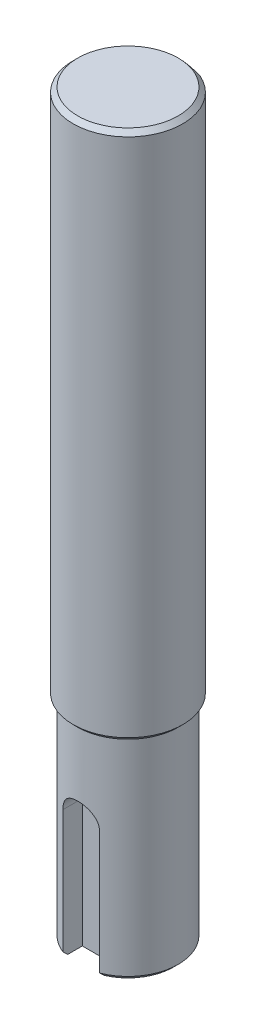
ISO-10303-21;
HEADER;
FILE_DESCRIPTION(('STEP AP214'),'2;1');
FILE_NAME('part.step','',(''),(''),'','','');
FILE_SCHEMA(('AUTOMOTIVE_DESIGN { 1 0 10303 214 1 1 1 1 }'));
ENDSEC;
DATA;
#1=APPLICATION_CONTEXT('core data for automotive mechanical design processes');
#2=APPLICATION_PROTOCOL_DEFINITION('international standard','automotive_design',2000,#1);
#3=PRODUCT_CONTEXT('',#1,'mechanical');
#4=PRODUCT('Part','Part','',(#3));
#5=PRODUCT_RELATED_PRODUCT_CATEGORY('part','',(#4));
#6=PRODUCT_DEFINITION_FORMATION('','',#4);
#7=PRODUCT_DEFINITION_CONTEXT('part definition',#1,'design');
#8=PRODUCT_DEFINITION('design','',#6,#7);
#9=PRODUCT_DEFINITION_SHAPE('','',#8);
#10=(LENGTH_UNIT() NAMED_UNIT(*) SI_UNIT(.MILLI.,.METRE.));
#11=(NAMED_UNIT(*) PLANE_ANGLE_UNIT() SI_UNIT($,.RADIAN.));
#12=(NAMED_UNIT(*) SI_UNIT($,.STERADIAN.) SOLID_ANGLE_UNIT());
#13=UNCERTAINTY_MEASURE_WITH_UNIT(LENGTH_MEASURE(1.E-05),#10,'distance_accuracy_value','');
#14=(GEOMETRIC_REPRESENTATION_CONTEXT(3) GLOBAL_UNCERTAINTY_ASSIGNED_CONTEXT((#13)) GLOBAL_UNIT_ASSIGNED_CONTEXT((#10,
#11,#12)) REPRESENTATION_CONTEXT('',''));
#15=CARTESIAN_POINT('',(0.,0.,0.));
#16=DIRECTION('',(0.,0.,1.));
#17=DIRECTION('',(1.,0.,0.));
#18=AXIS2_PLACEMENT_3D('',#15,#16,#17);
#19=CARTESIAN_POINT('',(0.,58.,0.));
#20=DIRECTION('',(0.,-1.,0.));
#21=DIRECTION('',(0.,0.,-1.));
#22=AXIS2_PLACEMENT_3D('',#19,#20,#21);
#23=CYLINDRICAL_SURFACE('',#22,6.);
#24=CARTESIAN_POINT('',(0.,0.500000000000028,0.));
#25=DIRECTION('',(0.,1.,0.));
#26=DIRECTION('',(0.,0.,1.));
#27=AXIS2_PLACEMENT_3D('',#24,#25,#26);
#28=CIRCLE('',#27,6.);
#29=CARTESIAN_POINT('',(0.,0.500000000000028,6.));
#30=VERTEX_POINT('',#29);
#31=EDGE_CURVE('E229',#30,#30,#28,.T.);
#32=ORIENTED_EDGE('',*,*,#31,.T.);
#33=EDGE_LOOP('',(#32));
#34=FACE_BOUND('',#33,.T.);
#35=DIRECTION('',(0.,-1.,0.));
#36=VECTOR('',#35,1.);
#37=CARTESIAN_POINT('',(2.39791576165636,58.,-5.5));
#38=LINE('',#37,#36);
#39=CARTESIAN_POINT('',(2.39791576165636,53.,-5.5));
#40=VERTEX_POINT('',#39);
#41=CARTESIAN_POINT('',(2.39791576165636,57.5,-5.5));
#42=VERTEX_POINT('',#41);
#43=EDGE_CURVE('E144',#40,#42,#38,.F.);
#44=ORIENTED_EDGE('',*,*,#43,.T.);
#45=CARTESIAN_POINT('',(0.,57.5,0.));
#46=DIRECTION('',(0.,1.,0.));
#47=DIRECTION('',(0.,0.,1.));
#48=AXIS2_PLACEMENT_3D('',#45,#46,#47);
#49=CIRCLE('',#48,6.);
#50=CARTESIAN_POINT('',(-2.39791576165636,57.5,-5.5));
#51=VERTEX_POINT('',#50);
#52=EDGE_CURVE('E162',#42,#51,#49,.F.);
#53=ORIENTED_EDGE('',*,*,#52,.T.);
#54=DIRECTION('',(0.,-1.,0.));
#55=VECTOR('',#54,1.);
#56=CARTESIAN_POINT('',(-2.39791576165636,58.,-5.5));
#57=LINE('',#56,#55);
#58=CARTESIAN_POINT('',(-2.39791576165636,53.,-5.5));
#59=VERTEX_POINT('',#58);
#60=EDGE_CURVE('E147',#51,#59,#57,.T.);
#61=ORIENTED_EDGE('',*,*,#60,.T.);
#62=CARTESIAN_POINT('',(0.,53.,0.));
#63=DIRECTION('',(0.,-1.,0.));
#64=DIRECTION('',(0.,0.,-1.));
#65=AXIS2_PLACEMENT_3D('',#62,#63,#64);
#66=CIRCLE('',#65,6.);
#67=EDGE_CURVE('E117',#59,#40,#66,.T.);
#68=ORIENTED_EDGE('',*,*,#67,.T.);
#69=EDGE_LOOP('',(#44,#53,#61,#68));
#70=FACE_BOUND('',#69,.T.);
#71=ADVANCED_FACE('F38',(#34,#70),#23,.T.);
#72=CARTESIAN_POINT('',(0.,58.,0.));
#73=DIRECTION('',(0.,1.,0.));
#74=DIRECTION('',(0.,0.,1.));
#75=AXIS2_PLACEMENT_3D('',#72,#73,#74);
#76=PLANE('',#75);
#77=CARTESIAN_POINT('',(0.,58.,0.));
#78=DIRECTION('',(0.,1.,0.));
#79=DIRECTION('',(0.,0.,1.));
#80=AXIS2_PLACEMENT_3D('',#77,#78,#79);
#81=CIRCLE('',#80,5.50000000000003);
#82=CARTESIAN_POINT('',(0.,58.,-5.5));
#83=VERTEX_POINT('',#82);
#84=EDGE_CURVE('E227',#83,#83,#81,.T.);
#85=ORIENTED_EDGE('',*,*,#84,.T.);
#86=EDGE_LOOP('',(#85));
#87=FACE_BOUND('',#86,.T.);
#88=ADVANCED_FACE('F218',(#87),#76,.T.);
#89=CARTESIAN_POINT('',(0.,-23.,0.));
#90=DIRECTION('',(0.,1.,0.));
#91=DIRECTION('',(0.,0.,1.));
#92=AXIS2_PLACEMENT_3D('',#89,#90,#91);
#93=CYLINDRICAL_SURFACE('',#92,5.5);
#94=DIRECTION('',(0.,1.,0.));
#95=VECTOR('',#94,1.);
#96=CARTESIAN_POINT('',(2.,-23.,5.1234753829798));
#97=LINE('',#96,#95);
#98=CARTESIAN_POINT('',(2.,-9.,5.1234753829798));
#99=VERTEX_POINT('',#98);
#100=CARTESIAN_POINT('',(2.,-22.5,5.1234753829798));
#101=VERTEX_POINT('',#100);
#102=EDGE_CURVE('E136',#99,#101,#97,.F.);
#103=ORIENTED_EDGE('',*,*,#102,.T.);
#104=CARTESIAN_POINT('',(0.,-22.5,0.));
#105=DIRECTION('',(0.,-1.,0.));
#106=DIRECTION('',(0.,0.,-1.));
#107=AXIS2_PLACEMENT_3D('',#104,#105,#106);
#108=CIRCLE('',#107,5.5);
#109=CARTESIAN_POINT('',(-2.,-22.5,5.1234753829798));
#110=VERTEX_POINT('',#109);
#111=EDGE_CURVE('E53',#101,#110,#108,.F.);
#112=ORIENTED_EDGE('',*,*,#111,.T.);
#113=DIRECTION('',(0.,1.,0.));
#114=VECTOR('',#113,1.);
#115=CARTESIAN_POINT('',(-2.,-23.,5.1234753829798));
#116=LINE('',#115,#114);
#117=CARTESIAN_POINT('',(-2.,-9.,5.1234753829798));
#118=VERTEX_POINT('',#117);
#119=EDGE_CURVE('E138',#110,#118,#116,.T.);
#120=ORIENTED_EDGE('',*,*,#119,.T.);
#121=CARTESIAN_POINT('',(-2.,-9.,5.1234753829798));
#122=CARTESIAN_POINT('',(-2.00000753314808,-8.9457612205785,5.12346565602725));
#123=CARTESIAN_POINT('',(-1.99779379827409,-8.89152779931448,5.12433643557664));
#124=CARTESIAN_POINT('',(-1.98898255908266,-8.78348869081595,5.12776648446225));
#125=CARTESIAN_POINT('',(-1.98238644308809,-8.72968287357905,5.13032521905848));
#126=CARTESIAN_POINT('',(-1.96489870016483,-8.62306136213237,5.13704737724638));
#127=CARTESIAN_POINT('',(-1.95402164560881,-8.57024293915523,5.14120535590845));
#128=CARTESIAN_POINT('',(-1.92808800203303,-8.46579405115342,5.15098705807193));
#129=CARTESIAN_POINT('',(-1.91303121833357,-8.4141636415843,5.15661084984592));
#130=CARTESIAN_POINT('',(-1.86180702208756,-8.26166194211137,5.1754238494232));
#131=CARTESIAN_POINT('',(-1.81955567746144,-8.16299921486576,5.19056699295785));
#132=CARTESIAN_POINT('',(-1.72018049401623,-7.97413528270298,5.22433904658501));
#133=CARTESIAN_POINT('',(-1.6630453414404,-7.8839405859228,5.24297060531306));
#134=CARTESIAN_POINT('',(-1.53267714707823,-7.71036260441923,5.28258709667612));
#135=CARTESIAN_POINT('',(-1.45886670296494,-7.62742715335248,5.30363814939348));
#136=CARTESIAN_POINT('',(-1.29847293044523,-7.47480160848479,5.34516826987225));
#137=CARTESIAN_POINT('',(-1.21188719525374,-7.40511401617131,5.36564722898827));
#138=CARTESIAN_POINT('',(-1.02500969613479,-7.27881839948359,5.40451062749924));
#139=CARTESIAN_POINT('',(-0.924370090053193,-7.22269581463109,5.42280793854183));
#140=CARTESIAN_POINT('',(-0.71429910730207,-7.12836416537001,5.45445105820857));
#141=CARTESIAN_POINT('',(-0.604870855549386,-7.09014876657132,5.46779861738183));
#142=CARTESIAN_POINT('',(-0.385063057544165,-7.03427989942651,5.48756774300281));
#143=CARTESIAN_POINT('',(-0.274904403065941,-7.01585125989477,5.49424962399435));
#144=CARTESIAN_POINT('',(-0.0528669835238519,-6.99760061885444,5.50086592457488));
#145=CARTESIAN_POINT('',(0.0590112772595827,-6.99777326275275,5.50080228593927));
#146=CARTESIAN_POINT('',(0.275772559853019,-7.01625811002758,5.49410312303007));
#147=CARTESIAN_POINT('',(0.380738725262411,-7.03372524843044,5.487773764585));
#148=CARTESIAN_POINT('',(0.586131937099525,-7.08488825668537,5.46965116666239));
#149=CARTESIAN_POINT('',(0.686558725995575,-7.11858504603057,5.45785761761182));
#150=CARTESIAN_POINT('',(0.881716601365395,-7.20167109645351,5.42977365386104));
#151=CARTESIAN_POINT('',(0.976346250593864,-7.25127692706534,5.41342161172991));
#152=CARTESIAN_POINT('',(1.15616748204336,-7.36458578481754,5.37788902184764));
#153=CARTESIAN_POINT('',(1.24135610896621,-7.42829320754222,5.35870759277619));
#154=CARTESIAN_POINT('',(1.404864894898,-7.57211539521224,5.31825524364858));
#155=CARTESIAN_POINT('',(1.48254558886144,-7.65294215958937,5.29692743161349));
#156=CARTESIAN_POINT('',(1.62349341794031,-7.8266369054807,5.25544299978234));
#157=CARTESIAN_POINT('',(1.68675521974002,-7.91950932262257,5.23528681539943));
#158=CARTESIAN_POINT('',(1.79820509788062,-8.11706081146007,5.19807570266242));
#159=CARTESIAN_POINT('',(1.84606144182333,-8.22194113436572,5.18109196181224));
#160=CARTESIAN_POINT('',(1.92314470149137,-8.43899755501663,5.15298201497763));
#161=CARTESIAN_POINT('',(1.95240231114569,-8.55116129375495,5.14184616339463));
#162=CARTESIAN_POINT('',(1.98115331401841,-8.72037878390417,5.13080109153432));
#163=CARTESIAN_POINT('',(1.98821538805375,-8.77605891183875,5.12806368923517));
#164=CARTESIAN_POINT('',(1.99763703693586,-8.8878154357511,5.12439847706825));
#165=CARTESIAN_POINT('',(2.00000152980534,-8.94389135555327,5.12346877469309));
#166=CARTESIAN_POINT('',(2.,-9.,5.1234753829798));
#167=B_SPLINE_CURVE_WITH_KNOTS('',3,(#121,#122,#123,#124,#125,#126,#127,#128,#129,#130,#131,
#132,#133,#134,#135,#136,#137,#138,#139,#140,#141,#142,#143,#144,#145,#146,#147,#148,#149,#150,
#151,#152,#153,#154,#155,#156,#157,#158,#159,#160,#161,#162,#163,#164,#165,#166),.UNSPECIFIED.,
.F.,.F.,(4,2,2,2,2,2,2,2,2,2,2,2,2,2,2,2,2,2,2,2,2,2,4),(0.,0.162655197714174,0.325258891390913,
0.487313801745629,0.649376261416068,0.972956522661165,1.29678347113774,1.63427074689126,
1.97182168451614,2.32008820197742,2.66823143237219,3.00217322695472,3.33601889281301,
3.65431862991543,3.97263640245517,4.29548576025188,4.61843589496831,4.95922780644115,
5.30014556751897,5.64797750864199,5.99523391397707,6.16361511870677,6.33181994758313),.UNSPECIFIED.);
#168=EDGE_CURVE('E116',#118,#99,#167,.T.);
#169=ORIENTED_EDGE('',*,*,#168,.T.);
#170=EDGE_LOOP('',(#103,#112,#120,#169));
#171=FACE_BOUND('',#170,.T.);
#172=CARTESIAN_POINT('',(0.,0.,0.));
#173=DIRECTION('',(0.,-1.,0.));
#174=DIRECTION('',(0.,0.,-1.));
#175=AXIS2_PLACEMENT_3D('',#172,#173,#174);
#176=CIRCLE('',#175,5.5);
#177=CARTESIAN_POINT('',(0.,0.,-5.5));
#178=VERTEX_POINT('',#177);
#179=EDGE_CURVE('E149',#178,#178,#176,.T.);
#180=ORIENTED_EDGE('',*,*,#179,.T.);
#181=EDGE_LOOP('',(#180));
#182=FACE_BOUND('',#181,.T.);
#183=ADVANCED_FACE('F164',(#171,#182),#93,.T.);
#184=CARTESIAN_POINT('',(0.,-23.,0.));
#185=DIRECTION('',(0.,-1.,0.));
#186=DIRECTION('',(0.,0.,-1.));
#187=AXIS2_PLACEMENT_3D('',#184,#185,#186);
#188=PLANE('',#187);
#189=DIRECTION('',(0.,0.,1.));
#190=VECTOR('',#189,1.);
#191=CARTESIAN_POINT('',(-2.,-23.,3.));
#192=LINE('',#191,#190);
#193=CARTESIAN_POINT('',(-2.,-23.,3.));
#194=VERTEX_POINT('',#193);
#195=CARTESIAN_POINT('',(-2.,-23.,4.58257569495585));
#196=VERTEX_POINT('',#195);
#197=EDGE_CURVE('E139',#194,#196,#192,.T.);
#198=ORIENTED_EDGE('',*,*,#197,.T.);
#199=CARTESIAN_POINT('',(0.,-23.,0.));
#200=DIRECTION('',(0.,-1.,0.));
#201=DIRECTION('',(0.,0.,-1.));
#202=AXIS2_PLACEMENT_3D('',#199,#200,#201);
#203=CIRCLE('',#202,5.);
#204=CARTESIAN_POINT('',(2.,-23.,4.58257569495585));
#205=VERTEX_POINT('',#204);
#206=EDGE_CURVE('E129',#196,#205,#203,.T.);
#207=ORIENTED_EDGE('',*,*,#206,.T.);
#208=DIRECTION('',(0.,0.,1.));
#209=VECTOR('',#208,1.);
#210=CARTESIAN_POINT('',(2.,-23.,3.));
#211=LINE('',#210,#209);
#212=CARTESIAN_POINT('',(2.,-23.,3.));
#213=VERTEX_POINT('',#212);
#214=EDGE_CURVE('E120',#213,#205,#211,.T.);
#215=ORIENTED_EDGE('',*,*,#214,.F.);
#216=DIRECTION('',(-1.,0.,0.));
#217=VECTOR('',#216,1.);
#218=CARTESIAN_POINT('',(0.,-23.,3.));
#219=LINE('',#218,#217);
#220=EDGE_CURVE('E105',#213,#194,#219,.T.);
#221=ORIENTED_EDGE('',*,*,#220,.T.);
#222=EDGE_LOOP('',(#198,#207,#215,#221));
#223=FACE_BOUND('',#222,.T.);
#224=ADVANCED_FACE('F127',(#223),#188,.T.);
#225=CARTESIAN_POINT('',(-2.5,53.,-10.5));
#226=DIRECTION('',(0.,-1.,0.));
#227=DIRECTION('',(0.,0.,-1.));
#228=AXIS2_PLACEMENT_3D('',#225,#226,#227);
#229=PLANE('',#228);
#230=DIRECTION('',(1.,0.,0.));
#231=VECTOR('',#230,1.);
#232=CARTESIAN_POINT('',(-2.5,53.,-5.5));
#233=LINE('',#232,#231);
#234=EDGE_CURVE('E141',#59,#40,#233,.T.);
#235=ORIENTED_EDGE('',*,*,#234,.T.);
#236=ORIENTED_EDGE('',*,*,#67,.F.);
#237=EDGE_LOOP('',(#235,#236));
#238=FACE_BOUND('',#237,.T.);
#239=ADVANCED_FACE('F240',(#238),#229,.F.);
#240=CARTESIAN_POINT('',(0.,0.,-5.5));
#241=DIRECTION('',(0.,0.,1.));
#242=DIRECTION('',(1.,0.,0.));
#243=AXIS2_PLACEMENT_3D('',#240,#241,#242);
#244=PLANE('',#243);
#245=CARTESIAN_POINT('',(-2.39791576165636,57.5,-5.5));
#246=CARTESIAN_POINT('',(-2.20666486003504,57.5764881983963,-5.5));
#247=CARTESIAN_POINT('',(-2.01243006139456,57.6463902745232,-5.5));
#248=CARTESIAN_POINT('',(-1.62065312981374,57.7691681430016,-5.5));
#249=CARTESIAN_POINT('',(-1.42315774234814,57.8221943813509,-5.5));
#250=CARTESIAN_POINT('',(-1.1235970049942,57.8872538345091,-5.5));
#251=CARTESIAN_POINT('',(-1.02310132017713,57.9065374907911,-5.5));
#252=CARTESIAN_POINT('',(-0.82124850353791,57.9399148103108,-5.5));
#253=CARTESIAN_POINT('',(-0.719891401758279,57.9540086537931,-5.5));
#254=CARTESIAN_POINT('',(-0.515628233014969,57.9768220812706,-5.5));
#255=CARTESIAN_POINT('',(-0.412716487165194,57.9854911597717,-5.5));
#256=CARTESIAN_POINT('',(-0.20653918928673,57.9970918311411,-5.5));
#257=CARTESIAN_POINT('',(-0.103273536776021,58.000021630842,-5.5));
#258=CARTESIAN_POINT('',(0.,58.,-5.5));
#259=B_SPLINE_CURVE_WITH_KNOTS('',3,(#245,#246,#247,#248,#249,#250,#251,#252,#253,#254,#255,
#256,#257,#258),.UNSPECIFIED.,.F.,.F.,(4,2,2,2,2,2,4),(0.,0.618334229933279,1.23099075616514,
1.53785513609969,1.84470885748819,2.15437851930643,2.46414491819936),.UNSPECIFIED.);
#260=EDGE_CURVE('E195',#51,#83,#259,.T.);
#261=ORIENTED_EDGE('',*,*,#260,.T.);
#262=CARTESIAN_POINT('',(0.,58.,-5.50000000000003));
#263=CARTESIAN_POINT('',(0.084366774007543,58.0000067189739,-5.50000000000001));
#264=CARTESIAN_POINT('',(0.168720923987895,57.9980578186782,-5.5));
#265=CARTESIAN_POINT('',(0.33723968631068,57.9903121414565,-5.5));
#266=CARTESIAN_POINT('',(0.421404326027069,57.9845159615218,-5.5));
#267=CARTESIAN_POINT('',(0.673126630386989,57.9614762477331,-5.5));
#268=CARTESIAN_POINT('',(0.840195143967198,57.9385811205927,-5.5));
#269=CARTESIAN_POINT('',(1.16963481124053,57.8793165155746,-5.5));
#270=CARTESIAN_POINT('',(1.33203875150392,57.8431243964337,-5.5));
#271=CARTESIAN_POINT('',(1.65372090738803,57.7588599546133,-5.5));
#272=CARTESIAN_POINT('',(1.81299901667663,57.7107872285419,-5.5));
#273=CARTESIAN_POINT('',(2.04237408031277,57.6334241719109,-5.5));
#274=CARTESIAN_POINT('',(2.11385610295841,57.6081400195841,-5.5));
#275=CARTESIAN_POINT('',(2.25631795082726,57.5555420880757,-5.5));
#276=CARTESIAN_POINT('',(2.32729558013952,57.5282223552427,-5.5));
#277=CARTESIAN_POINT('',(2.39791576165636,57.5,-5.5));
#278=B_SPLINE_CURVE_WITH_KNOTS('',3,(#262,#263,#264,#265,#266,#267,#268,#269,#270,#271,#272,
#273,#274,#275,#276,#277),.UNSPECIFIED.,.F.,.F.,(4,2,2,2,2,2,2,4),(0.,0.253053670035639,
0.506068082319285,1.01125269175482,1.50993013095569,2.00862450447979,2.23606855104534,
2.46420611947351),.UNSPECIFIED.);
#279=EDGE_CURVE('E189',#83,#42,#278,.T.);
#280=ORIENTED_EDGE('',*,*,#279,.T.);
#281=ORIENTED_EDGE('',*,*,#43,.F.);
#282=ORIENTED_EDGE('',*,*,#234,.F.);
#283=ORIENTED_EDGE('',*,*,#60,.F.);
#284=EDGE_LOOP('',(#261,#280,#281,#282,#283));
#285=FACE_BOUND('',#284,.T.);
#286=ADVANCED_FACE('F173',(#285),#244,.F.);
#287=CARTESIAN_POINT('',(0.,-9.,3.));
#288=DIRECTION('',(0.,0.,1.));
#289=DIRECTION('',(1.,0.,0.));
#290=AXIS2_PLACEMENT_3D('',#287,#288,#289);
#291=CYLINDRICAL_SURFACE('',#290,2.);
#292=DIRECTION('',(0.,0.,1.));
#293=VECTOR('',#292,1.);
#294=CARTESIAN_POINT('',(-2.,-9.,3.));
#295=LINE('',#294,#293);
#296=CARTESIAN_POINT('',(-2.,-9.,3.));
#297=VERTEX_POINT('',#296);
#298=EDGE_CURVE('E131',#297,#118,#295,.T.);
#299=ORIENTED_EDGE('',*,*,#298,.F.);
#300=CARTESIAN_POINT('',(0.,-9.,3.));
#301=DIRECTION('',(0.,0.,1.));
#302=DIRECTION('',(1.,0.,0.));
#303=AXIS2_PLACEMENT_3D('',#300,#301,#302);
#304=CIRCLE('',#303,2.);
#305=CARTESIAN_POINT('',(2.,-9.,3.));
#306=VERTEX_POINT('',#305);
#307=EDGE_CURVE('E124',#306,#297,#304,.T.);
#308=ORIENTED_EDGE('',*,*,#307,.F.);
#309=DIRECTION('',(0.,0.,1.));
#310=VECTOR('',#309,1.);
#311=CARTESIAN_POINT('',(2.,-9.,3.));
#312=LINE('',#311,#310);
#313=EDGE_CURVE('E122',#306,#99,#312,.T.);
#314=ORIENTED_EDGE('',*,*,#313,.T.);
#315=ORIENTED_EDGE('',*,*,#168,.F.);
#316=EDGE_LOOP('',(#299,#308,#314,#315));
#317=FACE_BOUND('',#316,.T.);
#318=ADVANCED_FACE('F168',(#317),#291,.F.);
#319=CARTESIAN_POINT('',(-2.,-23.,3.));
#320=DIRECTION('',(-1.,0.,0.));
#321=DIRECTION('',(0.,0.,1.));
#322=AXIS2_PLACEMENT_3D('',#319,#320,#321);
#323=PLANE('',#322);
#324=ORIENTED_EDGE('',*,*,#119,.F.);
#325=CARTESIAN_POINT('',(-2.,-22.5,5.1234753829798));
#326=CARTESIAN_POINT('',(-2.,-22.5836977065051,5.03366228889142));
#327=CARTESIAN_POINT('',(-2.,-22.667213218354,4.9436807766468));
#328=CARTESIAN_POINT('',(-2.,-22.8338798851624,4.76338088076987));
#329=CARTESIAN_POINT('',(-2.,-22.9170310399802,4.67306249700651));
#330=CARTESIAN_POINT('',(-2.,-23.,4.58257569495585));
#331=B_SPLINE_CURVE_WITH_KNOTS('',3,(#325,#326,#327,#328,#329,#330),.UNSPECIFIED.,.F.,.F.,(4,2,
4),(0.,0.368298275025699,0.736596693347574),.UNSPECIFIED.);
#332=EDGE_CURVE('E11',#110,#196,#331,.T.);
#333=ORIENTED_EDGE('',*,*,#332,.T.);
#334=ORIENTED_EDGE('',*,*,#197,.F.);
#335=DIRECTION('',(0.,-1.,0.));
#336=VECTOR('',#335,1.);
#337=CARTESIAN_POINT('',(-2.,-23.,3.));
#338=LINE('',#337,#336);
#339=EDGE_CURVE('E111',#297,#194,#338,.T.);
#340=ORIENTED_EDGE('',*,*,#339,.F.);
#341=ORIENTED_EDGE('',*,*,#298,.T.);
#342=EDGE_LOOP('',(#324,#333,#334,#340,#341));
#343=FACE_BOUND('',#342,.T.);
#344=ADVANCED_FACE('F172',(#343),#323,.F.);
#345=CARTESIAN_POINT('',(2.,-23.,3.));
#346=DIRECTION('',(1.,0.,0.));
#347=DIRECTION('',(0.,0.,-1.));
#348=AXIS2_PLACEMENT_3D('',#345,#346,#347);
#349=PLANE('',#348);
#350=ORIENTED_EDGE('',*,*,#214,.T.);
#351=CARTESIAN_POINT('',(2.,-23.,4.58257569495585));
#352=CARTESIAN_POINT('',(2.,-22.9170310399802,4.67306249700651));
#353=CARTESIAN_POINT('',(2.,-22.8338798851624,4.76338088076987));
#354=CARTESIAN_POINT('',(2.,-22.667213218354,4.9436807766468));
#355=CARTESIAN_POINT('',(2.,-22.5836977065051,5.03366228889142));
#356=CARTESIAN_POINT('',(2.,-22.5,5.1234753829798));
#357=B_SPLINE_CURVE_WITH_KNOTS('',3,(#351,#352,#353,#354,#355,#356),.UNSPECIFIED.,.F.,.F.,(4,2,
4),(0.,0.368298418321874,0.736596693347573),.UNSPECIFIED.);
#358=EDGE_CURVE('E67',#205,#101,#357,.T.);
#359=ORIENTED_EDGE('',*,*,#358,.T.);
#360=ORIENTED_EDGE('',*,*,#102,.F.);
#361=ORIENTED_EDGE('',*,*,#313,.F.);
#362=DIRECTION('',(0.,1.,0.));
#363=VECTOR('',#362,1.);
#364=CARTESIAN_POINT('',(2.,-23.,3.));
#365=LINE('',#364,#363);
#366=EDGE_CURVE('E109',#213,#306,#365,.T.);
#367=ORIENTED_EDGE('',*,*,#366,.F.);
#368=EDGE_LOOP('',(#350,#359,#360,#361,#367));
#369=FACE_BOUND('',#368,.T.);
#370=ADVANCED_FACE('F119',(#369),#349,.F.);
#371=CARTESIAN_POINT('',(0.,-23.,3.));
#372=DIRECTION('',(0.,0.,1.));
#373=DIRECTION('',(1.,0.,0.));
#374=AXIS2_PLACEMENT_3D('',#371,#372,#373);
#375=PLANE('',#374);
#376=ORIENTED_EDGE('',*,*,#366,.T.);
#377=ORIENTED_EDGE('',*,*,#307,.T.);
#378=ORIENTED_EDGE('',*,*,#339,.T.);
#379=ORIENTED_EDGE('',*,*,#220,.F.);
#380=EDGE_LOOP('',(#376,#377,#378,#379));
#381=FACE_BOUND('',#380,.T.);
#382=ADVANCED_FACE('F107',(#381),#375,.T.);
#383=CARTESIAN_POINT('',(0.,0.500000000000028,0.));
#384=DIRECTION('',(0.,1.,0.));
#385=DIRECTION('',(0.,0.,1.));
#386=AXIS2_PLACEMENT_3D('',#383,#384,#385);
#387=CONICAL_SURFACE('',#386,6.,0.78539816339745);
#388=ORIENTED_EDGE('',*,*,#179,.F.);
#389=EDGE_LOOP('',(#388));
#390=FACE_BOUND('',#389,.T.);
#391=ORIENTED_EDGE('',*,*,#31,.F.);
#392=EDGE_LOOP('',(#391));
#393=FACE_BOUND('',#392,.T.);
#394=ADVANCED_FACE('F209',(#390,#393),#387,.T.);
#395=CARTESIAN_POINT('',(0.,58.,0.));
#396=DIRECTION('',(0.,-1.,0.));
#397=DIRECTION('',(0.,0.,-1.));
#398=AXIS2_PLACEMENT_3D('',#395,#396,#397);
#399=CONICAL_SURFACE('',#398,5.50000000000003,0.785398163397451);
#400=ORIENTED_EDGE('',*,*,#260,.F.);
#401=ORIENTED_EDGE('',*,*,#52,.F.);
#402=ORIENTED_EDGE('',*,*,#279,.F.);
#403=ORIENTED_EDGE('',*,*,#84,.F.);
#404=EDGE_LOOP('',(#400,#401,#402,#403));
#405=FACE_BOUND('',#404,.T.);
#406=ADVANCED_FACE('F202',(#405),#399,.T.);
#407=CARTESIAN_POINT('',(0.,-23.,0.));
#408=DIRECTION('',(0.,1.,0.));
#409=DIRECTION('',(0.,0.,1.));
#410=AXIS2_PLACEMENT_3D('',#407,#408,#409);
#411=CONICAL_SURFACE('',#410,5.,0.78539816339745);
#412=ORIENTED_EDGE('',*,*,#332,.F.);
#413=ORIENTED_EDGE('',*,*,#111,.F.);
#414=ORIENTED_EDGE('',*,*,#358,.F.);
#415=ORIENTED_EDGE('',*,*,#206,.F.);
#416=EDGE_LOOP('',(#412,#413,#414,#415));
#417=FACE_BOUND('',#416,.T.);
#418=ADVANCED_FACE('F41',(#417),#411,.T.);
#419=CLOSED_SHELL('',(#71,#88,#183,#224,#239,#286,#318,#344,#370,#382,#394,#406,#418));
#420=MANIFOLD_SOLID_BREP('B2',#419);
#421=ADVANCED_BREP_SHAPE_REPRESENTATION('',(#18,#420),#14);
#422=SHAPE_DEFINITION_REPRESENTATION(#9,#421);
ENDSEC;
END-ISO-10303-21;
